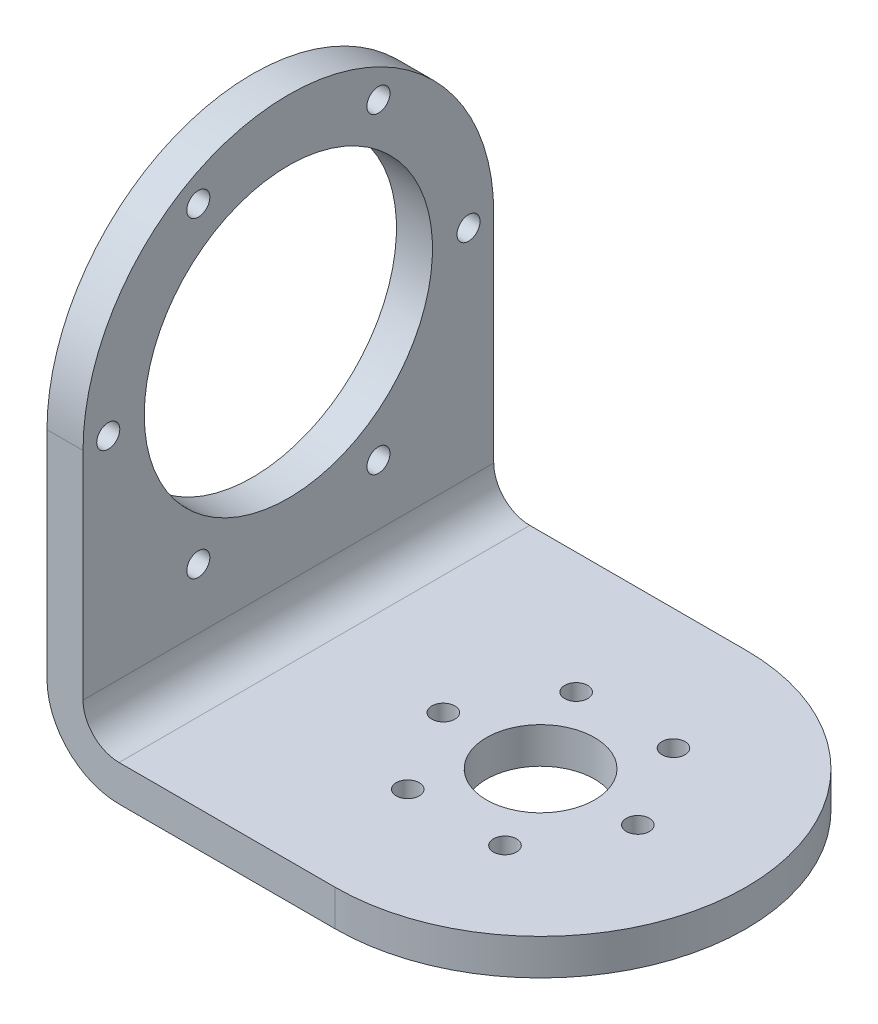
ISO-10303-21;
HEADER;
FILE_DESCRIPTION(('STEP AP214'),'2;1');
FILE_NAME('part.step','',(''),(''),'','','');
FILE_SCHEMA(('AUTOMOTIVE_DESIGN { 1 0 10303 214 1 1 1 1 }'));
ENDSEC;
DATA;
#1=APPLICATION_CONTEXT('core data for automotive mechanical design processes');
#2=APPLICATION_PROTOCOL_DEFINITION('international standard','automotive_design',2000,#1);
#3=PRODUCT_CONTEXT('',#1,'mechanical');
#4=PRODUCT('Part','Part','',(#3));
#5=PRODUCT_RELATED_PRODUCT_CATEGORY('part','',(#4));
#6=PRODUCT_DEFINITION_FORMATION('','',#4);
#7=PRODUCT_DEFINITION_CONTEXT('part definition',#1,'design');
#8=PRODUCT_DEFINITION('design','',#6,#7);
#9=PRODUCT_DEFINITION_SHAPE('','',#8);
#10=(LENGTH_UNIT() NAMED_UNIT(*) SI_UNIT(.MILLI.,.METRE.));
#11=(NAMED_UNIT(*) PLANE_ANGLE_UNIT() SI_UNIT($,.RADIAN.));
#12=(NAMED_UNIT(*) SI_UNIT($,.STERADIAN.) SOLID_ANGLE_UNIT());
#13=UNCERTAINTY_MEASURE_WITH_UNIT(LENGTH_MEASURE(1.E-05),#10,'distance_accuracy_value','');
#14=(GEOMETRIC_REPRESENTATION_CONTEXT(3) GLOBAL_UNCERTAINTY_ASSIGNED_CONTEXT((#13)) GLOBAL_UNIT_ASSIGNED_CONTEXT((#10,
#11,#12)) REPRESENTATION_CONTEXT('',''));
#15=CARTESIAN_POINT('',(0.,0.,0.));
#16=DIRECTION('',(0.,0.,1.));
#17=DIRECTION('',(1.,0.,0.));
#18=AXIS2_PLACEMENT_3D('',#15,#16,#17);
#19=CARTESIAN_POINT('',(0.,5.,28.5));
#20=DIRECTION('',(0.,0.,-1.));
#21=DIRECTION('',(-1.,0.,0.));
#22=AXIS2_PLACEMENT_3D('',#19,#20,#21);
#23=PLANE('',#22);
#24=DIRECTION('',(0.,-1.,0.));
#25=VECTOR('',#24,1.);
#26=CARTESIAN_POINT('',(-40.,5.,28.5));
#27=LINE('',#26,#25);
#28=CARTESIAN_POINT('',(-40.,40.,28.5));
#29=VERTEX_POINT('',#28);
#30=CARTESIAN_POINT('',(-40.,10.,28.5));
#31=VERTEX_POINT('',#30);
#32=EDGE_CURVE('E184',#29,#31,#27,.T.);
#33=ORIENTED_EDGE('',*,*,#32,.T.);
#34=CARTESIAN_POINT('',(-30.,10.,28.5));
#35=DIRECTION('',(0.,0.,-1.));
#36=DIRECTION('',(-1.,0.,0.));
#37=AXIS2_PLACEMENT_3D('',#34,#35,#36);
#38=CIRCLE('',#37,10.);
#39=CARTESIAN_POINT('',(-30.,0.,28.5));
#40=VERTEX_POINT('',#39);
#41=EDGE_CURVE('E203',#31,#40,#38,.F.);
#42=ORIENTED_EDGE('',*,*,#41,.T.);
#43=DIRECTION('',(1.,0.,0.));
#44=VECTOR('',#43,1.);
#45=CARTESIAN_POINT('',(0.,0.,28.5));
#46=LINE('',#45,#44);
#47=CARTESIAN_POINT('',(0.,0.,28.5));
#48=VERTEX_POINT('',#47);
#49=EDGE_CURVE('E175',#40,#48,#46,.T.);
#50=ORIENTED_EDGE('',*,*,#49,.T.);
#51=DIRECTION('',(0.,-1.,0.));
#52=VECTOR('',#51,1.);
#53=CARTESIAN_POINT('',(0.,5.,28.5));
#54=LINE('',#53,#52);
#55=CARTESIAN_POINT('',(0.,5.,28.5));
#56=VERTEX_POINT('',#55);
#57=EDGE_CURVE('E197',#56,#48,#54,.T.);
#58=ORIENTED_EDGE('',*,*,#57,.F.);
#59=DIRECTION('',(1.,0.,0.));
#60=VECTOR('',#59,1.);
#61=CARTESIAN_POINT('',(0.,5.,28.5));
#62=LINE('',#61,#60);
#63=CARTESIAN_POINT('',(-30.,5.,28.5));
#64=VERTEX_POINT('',#63);
#65=EDGE_CURVE('E177',#64,#56,#62,.T.);
#66=ORIENTED_EDGE('',*,*,#65,.F.);
#67=CARTESIAN_POINT('',(-30.,10.,28.5));
#68=DIRECTION('',(0.,0.,-1.));
#69=DIRECTION('',(-1.,0.,0.));
#70=AXIS2_PLACEMENT_3D('',#67,#68,#69);
#71=CIRCLE('',#70,5.);
#72=CARTESIAN_POINT('',(-35.,10.,28.5));
#73=VERTEX_POINT('',#72);
#74=EDGE_CURVE('E11',#64,#73,#71,.T.);
#75=ORIENTED_EDGE('',*,*,#74,.T.);
#76=DIRECTION('',(0.,1.,0.));
#77=VECTOR('',#76,1.);
#78=CARTESIAN_POINT('',(-35.,0.,28.5));
#79=LINE('',#78,#77);
#80=CARTESIAN_POINT('',(-35.,40.,28.5));
#81=VERTEX_POINT('',#80);
#82=EDGE_CURVE('E103',#73,#81,#79,.T.);
#83=ORIENTED_EDGE('',*,*,#82,.T.);
#84=DIRECTION('',(-1.,0.,0.));
#85=VECTOR('',#84,1.);
#86=CARTESIAN_POINT('',(-35.,40.,28.5));
#87=LINE('',#86,#85);
#88=EDGE_CURVE('E106',#81,#29,#87,.T.);
#89=ORIENTED_EDGE('',*,*,#88,.T.);
#90=EDGE_LOOP('',(#33,#42,#50,#58,#66,#75,#83,#89));
#91=FACE_BOUND('',#90,.T.);
#92=ADVANCED_FACE('F39',(#91),#23,.F.);
#93=CARTESIAN_POINT('',(0.,5.,0.));
#94=DIRECTION('',(0.,-1.,0.));
#95=DIRECTION('',(0.,0.,-1.));
#96=AXIS2_PLACEMENT_3D('',#93,#94,#95);
#97=CYLINDRICAL_SURFACE('',#96,28.5);
#98=CARTESIAN_POINT('',(0.,0.,0.));
#99=DIRECTION('',(0.,1.,0.));
#100=DIRECTION('',(0.,0.,1.));
#101=AXIS2_PLACEMENT_3D('',#98,#99,#100);
#102=CIRCLE('',#101,28.5);
#103=CARTESIAN_POINT('',(0.,0.,-28.5));
#104=VERTEX_POINT('',#103);
#105=EDGE_CURVE('E186',#48,#104,#102,.T.);
#106=ORIENTED_EDGE('',*,*,#105,.T.);
#107=DIRECTION('',(0.,-1.,0.));
#108=VECTOR('',#107,1.);
#109=CARTESIAN_POINT('',(0.,5.,-28.5));
#110=LINE('',#109,#108);
#111=CARTESIAN_POINT('',(0.,5.,-28.5));
#112=VERTEX_POINT('',#111);
#113=EDGE_CURVE('E194',#112,#104,#110,.T.);
#114=ORIENTED_EDGE('',*,*,#113,.F.);
#115=CARTESIAN_POINT('',(0.,5.,0.));
#116=DIRECTION('',(0.,1.,0.));
#117=DIRECTION('',(0.,0.,1.));
#118=AXIS2_PLACEMENT_3D('',#115,#116,#117);
#119=CIRCLE('',#118,28.5);
#120=EDGE_CURVE('E179',#56,#112,#119,.T.);
#121=ORIENTED_EDGE('',*,*,#120,.F.);
#122=ORIENTED_EDGE('',*,*,#57,.T.);
#123=EDGE_LOOP('',(#106,#114,#121,#122));
#124=FACE_BOUND('',#123,.T.);
#125=ADVANCED_FACE('F230',(#124),#97,.T.);
#126=CARTESIAN_POINT('',(0.,5.,-28.5));
#127=DIRECTION('',(0.,0.,1.));
#128=DIRECTION('',(1.,0.,0.));
#129=AXIS2_PLACEMENT_3D('',#126,#127,#128);
#130=PLANE('',#129);
#131=DIRECTION('',(-1.,0.,0.));
#132=VECTOR('',#131,1.);
#133=CARTESIAN_POINT('',(0.,0.,-28.5));
#134=LINE('',#133,#132);
#135=CARTESIAN_POINT('',(-30.,0.,-28.5));
#136=VERTEX_POINT('',#135);
#137=EDGE_CURVE('E180',#104,#136,#134,.T.);
#138=ORIENTED_EDGE('',*,*,#137,.T.);
#139=CARTESIAN_POINT('',(-30.,10.,-28.5));
#140=DIRECTION('',(0.,0.,1.));
#141=DIRECTION('',(1.,0.,0.));
#142=AXIS2_PLACEMENT_3D('',#139,#140,#141);
#143=CIRCLE('',#142,10.);
#144=CARTESIAN_POINT('',(-40.,10.,-28.5));
#145=VERTEX_POINT('',#144);
#146=EDGE_CURVE('E207',#136,#145,#143,.F.);
#147=ORIENTED_EDGE('',*,*,#146,.T.);
#148=DIRECTION('',(0.,-1.,0.));
#149=VECTOR('',#148,1.);
#150=CARTESIAN_POINT('',(-40.,5.,-28.5));
#151=LINE('',#150,#149);
#152=CARTESIAN_POINT('',(-40.,40.,-28.5));
#153=VERTEX_POINT('',#152);
#154=EDGE_CURVE('E191',#153,#145,#151,.T.);
#155=ORIENTED_EDGE('',*,*,#154,.F.);
#156=DIRECTION('',(-1.,0.,0.));
#157=VECTOR('',#156,1.);
#158=CARTESIAN_POINT('',(-35.,40.,-28.5));
#159=LINE('',#158,#157);
#160=CARTESIAN_POINT('',(-35.,40.,-28.5));
#161=VERTEX_POINT('',#160);
#162=EDGE_CURVE('E122',#161,#153,#159,.T.);
#163=ORIENTED_EDGE('',*,*,#162,.F.);
#164=DIRECTION('',(0.,-1.,0.));
#165=VECTOR('',#164,1.);
#166=CARTESIAN_POINT('',(-35.,0.,-28.5));
#167=LINE('',#166,#165);
#168=CARTESIAN_POINT('',(-35.,10.,-28.5));
#169=VERTEX_POINT('',#168);
#170=EDGE_CURVE('E128',#161,#169,#167,.T.);
#171=ORIENTED_EDGE('',*,*,#170,.T.);
#172=CARTESIAN_POINT('',(-30.,10.,-28.5));
#173=DIRECTION('',(0.,0.,1.));
#174=DIRECTION('',(1.,0.,0.));
#175=AXIS2_PLACEMENT_3D('',#172,#173,#174);
#176=CIRCLE('',#175,5.);
#177=CARTESIAN_POINT('',(-30.,5.,-28.5));
#178=VERTEX_POINT('',#177);
#179=EDGE_CURVE('E47',#169,#178,#176,.T.);
#180=ORIENTED_EDGE('',*,*,#179,.T.);
#181=DIRECTION('',(-1.,0.,0.));
#182=VECTOR('',#181,1.);
#183=CARTESIAN_POINT('',(0.,5.,-28.5));
#184=LINE('',#183,#182);
#185=EDGE_CURVE('E182',#112,#178,#184,.T.);
#186=ORIENTED_EDGE('',*,*,#185,.F.);
#187=ORIENTED_EDGE('',*,*,#113,.T.);
#188=EDGE_LOOP('',(#138,#147,#155,#163,#171,#180,#186,#187));
#189=FACE_BOUND('',#188,.T.);
#190=ADVANCED_FACE('F212',(#189),#130,.F.);
#191=CARTESIAN_POINT('',(-40.,5.,0.));
#192=DIRECTION('',(1.,0.,0.));
#193=DIRECTION('',(0.,0.,-1.));
#194=AXIS2_PLACEMENT_3D('',#191,#192,#193);
#195=PLANE('',#194);
#196=ORIENTED_EDGE('',*,*,#154,.T.);
#197=DIRECTION('',(0.,0.,1.));
#198=VECTOR('',#197,1.);
#199=CARTESIAN_POINT('',(-40.,10.,0.));
#200=LINE('',#199,#198);
#201=EDGE_CURVE('E200',#145,#31,#200,.T.);
#202=ORIENTED_EDGE('',*,*,#201,.T.);
#203=ORIENTED_EDGE('',*,*,#32,.F.);
#204=CARTESIAN_POINT('',(-40.,40.,0.));
#205=DIRECTION('',(-1.,0.,0.));
#206=DIRECTION('',(0.,0.,1.));
#207=AXIS2_PLACEMENT_3D('',#204,#205,#206);
#208=CIRCLE('',#207,28.5);
#209=EDGE_CURVE('E121',#29,#153,#208,.T.);
#210=ORIENTED_EDGE('',*,*,#209,.T.);
#211=EDGE_LOOP('',(#196,#202,#203,#210));
#212=FACE_BOUND('',#211,.T.);
#213=CARTESIAN_POINT('',(-40.,39.9999999999999,-24.9999999999994));
#214=DIRECTION('',(-1.,0.,0.));
#215=DIRECTION('',(0.,0.,1.));
#216=AXIS2_PLACEMENT_3D('',#213,#214,#215);
#217=CIRCLE('',#216,1.6);
#218=CARTESIAN_POINT('',(-40.,39.9999999999999,-23.3999999999994));
#219=VERTEX_POINT('',#218);
#220=EDGE_CURVE('E154',#219,#219,#217,.T.);
#221=ORIENTED_EDGE('',*,*,#220,.F.);
#222=EDGE_LOOP('',(#221));
#223=FACE_BOUND('',#222,.T.);
#224=CARTESIAN_POINT('',(-40.,18.3493649053891,-12.4999999999989));
#225=DIRECTION('',(-1.,0.,0.));
#226=DIRECTION('',(0.,0.,1.));
#227=AXIS2_PLACEMENT_3D('',#224,#225,#226);
#228=CIRCLE('',#227,1.60000000000001);
#229=CARTESIAN_POINT('',(-40.,18.3493649053891,-10.8999999999989));
#230=VERTEX_POINT('',#229);
#231=EDGE_CURVE('E158',#230,#230,#228,.T.);
#232=ORIENTED_EDGE('',*,*,#231,.F.);
#233=EDGE_LOOP('',(#232));
#234=FACE_BOUND('',#233,.T.);
#235=CARTESIAN_POINT('',(-40.,18.3493649053897,12.5000000000011));
#236=DIRECTION('',(-1.,0.,0.));
#237=DIRECTION('',(0.,0.,1.));
#238=AXIS2_PLACEMENT_3D('',#235,#236,#237);
#239=CIRCLE('',#238,1.6);
#240=CARTESIAN_POINT('',(-40.,18.3493649053897,14.1000000000011));
#241=VERTEX_POINT('',#240);
#242=EDGE_CURVE('E161',#241,#241,#239,.T.);
#243=ORIENTED_EDGE('',*,*,#242,.F.);
#244=EDGE_LOOP('',(#243));
#245=FACE_BOUND('',#244,.T.);
#246=CARTESIAN_POINT('',(-40.,40.000000000001,25.0000000000006));
#247=DIRECTION('',(-1.,0.,0.));
#248=DIRECTION('',(0.,0.,1.));
#249=AXIS2_PLACEMENT_3D('',#246,#247,#248);
#250=CIRCLE('',#249,1.6);
#251=CARTESIAN_POINT('',(-40.,40.000000000001,26.6000000000006));
#252=VERTEX_POINT('',#251);
#253=EDGE_CURVE('E164',#252,#252,#250,.T.);
#254=ORIENTED_EDGE('',*,*,#253,.F.);
#255=EDGE_LOOP('',(#254));
#256=FACE_BOUND('',#255,.T.);
#257=CARTESIAN_POINT('',(-40.,61.6506350946116,12.5));
#258=DIRECTION('',(-1.,0.,0.));
#259=DIRECTION('',(0.,0.,1.));
#260=AXIS2_PLACEMENT_3D('',#257,#258,#259);
#261=CIRCLE('',#260,1.6);
#262=CARTESIAN_POINT('',(-40.,61.6506350946116,14.1));
#263=VERTEX_POINT('',#262);
#264=EDGE_CURVE('E167',#263,#263,#261,.T.);
#265=ORIENTED_EDGE('',*,*,#264,.F.);
#266=EDGE_LOOP('',(#265));
#267=FACE_BOUND('',#266,.T.);
#268=CARTESIAN_POINT('',(-40.,61.6506350946109,-12.5));
#269=DIRECTION('',(-1.,0.,0.));
#270=DIRECTION('',(0.,0.,1.));
#271=AXIS2_PLACEMENT_3D('',#268,#269,#270);
#272=CIRCLE('',#271,1.6);
#273=CARTESIAN_POINT('',(-40.,61.6506350946109,-10.9));
#274=VERTEX_POINT('',#273);
#275=EDGE_CURVE('E170',#274,#274,#272,.T.);
#276=ORIENTED_EDGE('',*,*,#275,.F.);
#277=EDGE_LOOP('',(#276));
#278=FACE_BOUND('',#277,.T.);
#279=CARTESIAN_POINT('',(-40.,40.,0.));
#280=DIRECTION('',(-1.,0.,0.));
#281=DIRECTION('',(0.,0.,1.));
#282=AXIS2_PLACEMENT_3D('',#279,#280,#281);
#283=CIRCLE('',#282,20.);
#284=CARTESIAN_POINT('',(-40.,40.,20.));
#285=VERTEX_POINT('',#284);
#286=EDGE_CURVE('E114',#285,#285,#283,.T.);
#287=ORIENTED_EDGE('',*,*,#286,.F.);
#288=EDGE_LOOP('',(#287));
#289=FACE_BOUND('',#288,.T.);
#290=ADVANCED_FACE('F214',(#212,#223,#234,#245,#256,#267,#278,#289),#195,.F.);
#291=CARTESIAN_POINT('',(0.,5.,0.));
#292=DIRECTION('',(0.,1.,0.));
#293=DIRECTION('',(0.,0.,1.));
#294=AXIS2_PLACEMENT_3D('',#291,#292,#293);
#295=PLANE('',#294);
#296=CARTESIAN_POINT('',(13.5,5.,0.));
#297=DIRECTION('',(0.,1.,0.));
#298=DIRECTION('',(0.,0.,1.));
#299=AXIS2_PLACEMENT_3D('',#296,#297,#298);
#300=CIRCLE('',#299,1.6);
#301=CARTESIAN_POINT('',(13.5,5.,1.6));
#302=VERTEX_POINT('',#301);
#303=EDGE_CURVE('E319',#302,#302,#300,.T.);
#304=ORIENTED_EDGE('',*,*,#303,.F.);
#305=EDGE_LOOP('',(#304));
#306=FACE_BOUND('',#305,.T.);
#307=CARTESIAN_POINT('',(-13.5,5.,0.));
#308=DIRECTION('',(0.,1.,0.));
#309=DIRECTION('',(0.,0.,1.));
#310=AXIS2_PLACEMENT_3D('',#307,#308,#309);
#311=CIRCLE('',#310,1.6);
#312=CARTESIAN_POINT('',(-13.5,5.,1.59999999999991));
#313=VERTEX_POINT('',#312);
#314=EDGE_CURVE('E337',#313,#313,#311,.T.);
#315=ORIENTED_EDGE('',*,*,#314,.F.);
#316=EDGE_LOOP('',(#315));
#317=FACE_BOUND('',#316,.T.);
#318=CARTESIAN_POINT('',(-6.75000000000005,5.,11.6913429510899));
#319=DIRECTION('',(0.,1.,0.));
#320=DIRECTION('',(0.,0.,1.));
#321=AXIS2_PLACEMENT_3D('',#318,#319,#320);
#322=CIRCLE('',#321,1.6);
#323=CARTESIAN_POINT('',(-6.75000000000005,5.,13.2913429510899));
#324=VERTEX_POINT('',#323);
#325=EDGE_CURVE('E331',#324,#324,#322,.T.);
#326=ORIENTED_EDGE('',*,*,#325,.F.);
#327=EDGE_LOOP('',(#326));
#328=FACE_BOUND('',#327,.T.);
#329=CARTESIAN_POINT('',(6.74999999999997,5.,11.6913429510899));
#330=DIRECTION('',(0.,1.,0.));
#331=DIRECTION('',(0.,0.,1.));
#332=AXIS2_PLACEMENT_3D('',#329,#330,#331);
#333=CIRCLE('',#332,1.6);
#334=CARTESIAN_POINT('',(6.74999999999997,5.,13.2913429510899));
#335=VERTEX_POINT('',#334);
#336=EDGE_CURVE('E330',#335,#335,#333,.T.);
#337=ORIENTED_EDGE('',*,*,#336,.F.);
#338=EDGE_LOOP('',(#337));
#339=FACE_BOUND('',#338,.T.);
#340=CARTESIAN_POINT('',(0.,5.,0.));
#341=DIRECTION('',(0.,1.,0.));
#342=DIRECTION('',(0.,0.,1.));
#343=AXIS2_PLACEMENT_3D('',#340,#341,#342);
#344=CIRCLE('',#343,7.5);
#345=CARTESIAN_POINT('',(0.,5.,7.5));
#346=VERTEX_POINT('',#345);
#347=EDGE_CURVE('E324',#346,#346,#344,.T.);
#348=ORIENTED_EDGE('',*,*,#347,.F.);
#349=EDGE_LOOP('',(#348));
#350=FACE_BOUND('',#349,.T.);
#351=CARTESIAN_POINT('',(-6.74999999999989,5.,-11.69134295109));
#352=DIRECTION('',(0.,1.,0.));
#353=DIRECTION('',(0.,0.,1.));
#354=AXIS2_PLACEMENT_3D('',#351,#352,#353);
#355=CIRCLE('',#354,1.6);
#356=CARTESIAN_POINT('',(-6.74999999999989,5.,-10.09134295109));
#357=VERTEX_POINT('',#356);
#358=EDGE_CURVE('E350',#357,#357,#355,.T.);
#359=ORIENTED_EDGE('',*,*,#358,.F.);
#360=EDGE_LOOP('',(#359));
#361=FACE_BOUND('',#360,.T.);
#362=CARTESIAN_POINT('',(6.75000000000014,5.,-11.6913429510898));
#363=DIRECTION('',(0.,1.,0.));
#364=DIRECTION('',(0.,0.,1.));
#365=AXIS2_PLACEMENT_3D('',#362,#363,#364);
#366=CIRCLE('',#365,1.6);
#367=CARTESIAN_POINT('',(6.75000000000014,5.,-10.0913429510898));
#368=VERTEX_POINT('',#367);
#369=EDGE_CURVE('E355',#368,#368,#366,.T.);
#370=ORIENTED_EDGE('',*,*,#369,.F.);
#371=EDGE_LOOP('',(#370));
#372=FACE_BOUND('',#371,.T.);
#373=ORIENTED_EDGE('',*,*,#185,.T.);
#374=DIRECTION('',(0.,0.,-1.));
#375=VECTOR('',#374,1.);
#376=CARTESIAN_POINT('',(-30.,5.,0.));
#377=LINE('',#376,#375);
#378=EDGE_CURVE('E60',#178,#64,#377,.F.);
#379=ORIENTED_EDGE('',*,*,#378,.T.);
#380=ORIENTED_EDGE('',*,*,#65,.T.);
#381=ORIENTED_EDGE('',*,*,#120,.T.);
#382=EDGE_LOOP('',(#373,#379,#380,#381));
#383=FACE_BOUND('',#382,.T.);
#384=ADVANCED_FACE('F251',(#306,#317,#328,#339,#350,#361,#372,#383),#295,.T.);
#385=CARTESIAN_POINT('',(0.,0.,0.));
#386=DIRECTION('',(0.,1.,0.));
#387=DIRECTION('',(0.,0.,1.));
#388=AXIS2_PLACEMENT_3D('',#385,#386,#387);
#389=PLANE('',#388);
#390=CARTESIAN_POINT('',(13.5,0.,0.));
#391=DIRECTION('',(0.,1.,0.));
#392=DIRECTION('',(0.,0.,1.));
#393=AXIS2_PLACEMENT_3D('',#390,#391,#392);
#394=CIRCLE('',#393,1.6);
#395=CARTESIAN_POINT('',(13.5,0.,1.6));
#396=VERTEX_POINT('',#395);
#397=EDGE_CURVE('E155',#396,#396,#394,.T.);
#398=ORIENTED_EDGE('',*,*,#397,.T.);
#399=EDGE_LOOP('',(#398));
#400=FACE_BOUND('',#399,.T.);
#401=CARTESIAN_POINT('',(-13.5,0.,0.));
#402=DIRECTION('',(0.,1.,0.));
#403=DIRECTION('',(0.,0.,1.));
#404=AXIS2_PLACEMENT_3D('',#401,#402,#403);
#405=CIRCLE('',#404,1.6);
#406=CARTESIAN_POINT('',(-13.5,0.,1.59999999999991));
#407=VERTEX_POINT('',#406);
#408=EDGE_CURVE('E334',#407,#407,#405,.T.);
#409=ORIENTED_EDGE('',*,*,#408,.T.);
#410=EDGE_LOOP('',(#409));
#411=FACE_BOUND('',#410,.T.);
#412=CARTESIAN_POINT('',(-6.75000000000005,0.,11.6913429510899));
#413=DIRECTION('',(0.,1.,0.));
#414=DIRECTION('',(0.,0.,1.));
#415=AXIS2_PLACEMENT_3D('',#412,#413,#414);
#416=CIRCLE('',#415,1.6);
#417=CARTESIAN_POINT('',(-6.75000000000005,0.,13.2913429510899));
#418=VERTEX_POINT('',#417);
#419=EDGE_CURVE('E327',#418,#418,#416,.T.);
#420=ORIENTED_EDGE('',*,*,#419,.T.);
#421=EDGE_LOOP('',(#420));
#422=FACE_BOUND('',#421,.T.);
#423=CARTESIAN_POINT('',(6.74999999999997,0.,11.6913429510899));
#424=DIRECTION('',(0.,1.,0.));
#425=DIRECTION('',(0.,0.,1.));
#426=AXIS2_PLACEMENT_3D('',#423,#424,#425);
#427=CIRCLE('',#426,1.6);
#428=CARTESIAN_POINT('',(6.74999999999997,0.,13.2913429510899));
#429=VERTEX_POINT('',#428);
#430=EDGE_CURVE('E343',#429,#429,#427,.T.);
#431=ORIENTED_EDGE('',*,*,#430,.T.);
#432=EDGE_LOOP('',(#431));
#433=FACE_BOUND('',#432,.T.);
#434=CARTESIAN_POINT('',(0.,0.,0.));
#435=DIRECTION('',(0.,1.,0.));
#436=DIRECTION('',(0.,0.,1.));
#437=AXIS2_PLACEMENT_3D('',#434,#435,#436);
#438=CIRCLE('',#437,7.5);
#439=CARTESIAN_POINT('',(0.,0.,7.5));
#440=VERTEX_POINT('',#439);
#441=EDGE_CURVE('E320',#440,#440,#438,.T.);
#442=ORIENTED_EDGE('',*,*,#441,.T.);
#443=EDGE_LOOP('',(#442));
#444=FACE_BOUND('',#443,.T.);
#445=CARTESIAN_POINT('',(-6.74999999999989,0.,-11.69134295109));
#446=DIRECTION('',(0.,1.,0.));
#447=DIRECTION('',(0.,0.,1.));
#448=AXIS2_PLACEMENT_3D('',#445,#446,#447);
#449=CIRCLE('',#448,1.6);
#450=CARTESIAN_POINT('',(-6.74999999999989,0.,-10.09134295109));
#451=VERTEX_POINT('',#450);
#452=EDGE_CURVE('E339',#451,#451,#449,.T.);
#453=ORIENTED_EDGE('',*,*,#452,.T.);
#454=EDGE_LOOP('',(#453));
#455=FACE_BOUND('',#454,.T.);
#456=CARTESIAN_POINT('',(6.75000000000014,0.,-11.6913429510898));
#457=DIRECTION('',(0.,1.,0.));
#458=DIRECTION('',(0.,0.,1.));
#459=AXIS2_PLACEMENT_3D('',#456,#457,#458);
#460=CIRCLE('',#459,1.6);
#461=CARTESIAN_POINT('',(6.75000000000014,0.,-10.0913429510898));
#462=VERTEX_POINT('',#461);
#463=EDGE_CURVE('E353',#462,#462,#460,.T.);
#464=ORIENTED_EDGE('',*,*,#463,.T.);
#465=EDGE_LOOP('',(#464));
#466=FACE_BOUND('',#465,.T.);
#467=ORIENTED_EDGE('',*,*,#49,.F.);
#468=DIRECTION('',(0.,0.,1.));
#469=VECTOR('',#468,1.);
#470=CARTESIAN_POINT('',(-30.,0.,0.));
#471=LINE('',#470,#469);
#472=EDGE_CURVE('E205',#40,#136,#471,.F.);
#473=ORIENTED_EDGE('',*,*,#472,.T.);
#474=ORIENTED_EDGE('',*,*,#137,.F.);
#475=ORIENTED_EDGE('',*,*,#105,.F.);
#476=EDGE_LOOP('',(#467,#473,#474,#475));
#477=FACE_BOUND('',#476,.T.);
#478=ADVANCED_FACE('F223',(#400,#411,#422,#433,#444,#455,#466,#477),#389,.F.);
#479=CARTESIAN_POINT('',(-35.,61.6506350946109,-12.5));
#480=DIRECTION('',(-1.,0.,0.));
#481=DIRECTION('',(0.,0.,1.));
#482=AXIS2_PLACEMENT_3D('',#479,#480,#481);
#483=CYLINDRICAL_SURFACE('',#482,1.6);
#484=CARTESIAN_POINT('',(-35.,61.6506350946109,-12.5));
#485=DIRECTION('',(-1.,0.,0.));
#486=DIRECTION('',(0.,0.,1.));
#487=AXIS2_PLACEMENT_3D('',#484,#485,#486);
#488=CIRCLE('',#487,1.6);
#489=CARTESIAN_POINT('',(-35.,61.6506350946109,-10.9));
#490=VERTEX_POINT('',#489);
#491=EDGE_CURVE('E148',#490,#490,#488,.T.);
#492=ORIENTED_EDGE('',*,*,#491,.F.);
#493=EDGE_LOOP('',(#492));
#494=FACE_BOUND('',#493,.T.);
#495=ORIENTED_EDGE('',*,*,#275,.T.);
#496=EDGE_LOOP('',(#495));
#497=FACE_BOUND('',#496,.T.);
#498=ADVANCED_FACE('F254',(#494,#497),#483,.F.);
#499=CARTESIAN_POINT('',(-35.,61.6506350946116,12.5));
#500=DIRECTION('',(-1.,0.,0.));
#501=DIRECTION('',(0.,0.,1.));
#502=AXIS2_PLACEMENT_3D('',#499,#500,#501);
#503=CYLINDRICAL_SURFACE('',#502,1.6);
#504=CARTESIAN_POINT('',(-35.,61.6506350946116,12.5));
#505=DIRECTION('',(-1.,0.,0.));
#506=DIRECTION('',(0.,0.,1.));
#507=AXIS2_PLACEMENT_3D('',#504,#505,#506);
#508=CIRCLE('',#507,1.6);
#509=CARTESIAN_POINT('',(-35.,61.6506350946116,14.1));
#510=VERTEX_POINT('',#509);
#511=EDGE_CURVE('E145',#510,#510,#508,.T.);
#512=ORIENTED_EDGE('',*,*,#511,.F.);
#513=EDGE_LOOP('',(#512));
#514=FACE_BOUND('',#513,.T.);
#515=ORIENTED_EDGE('',*,*,#264,.T.);
#516=EDGE_LOOP('',(#515));
#517=FACE_BOUND('',#516,.T.);
#518=ADVANCED_FACE('F277',(#514,#517),#503,.F.);
#519=CARTESIAN_POINT('',(-35.,40.000000000001,25.0000000000006));
#520=DIRECTION('',(-1.,0.,0.));
#521=DIRECTION('',(0.,0.,1.));
#522=AXIS2_PLACEMENT_3D('',#519,#520,#521);
#523=CYLINDRICAL_SURFACE('',#522,1.6);
#524=CARTESIAN_POINT('',(-35.,40.000000000001,25.0000000000006));
#525=DIRECTION('',(-1.,0.,0.));
#526=DIRECTION('',(0.,0.,1.));
#527=AXIS2_PLACEMENT_3D('',#524,#525,#526);
#528=CIRCLE('',#527,1.6);
#529=CARTESIAN_POINT('',(-35.,40.000000000001,26.6000000000006));
#530=VERTEX_POINT('',#529);
#531=EDGE_CURVE('E142',#530,#530,#528,.T.);
#532=ORIENTED_EDGE('',*,*,#531,.F.);
#533=EDGE_LOOP('',(#532));
#534=FACE_BOUND('',#533,.T.);
#535=ORIENTED_EDGE('',*,*,#253,.T.);
#536=EDGE_LOOP('',(#535));
#537=FACE_BOUND('',#536,.T.);
#538=ADVANCED_FACE('F273',(#534,#537),#523,.F.);
#539=CARTESIAN_POINT('',(-35.,18.3493649053897,12.5000000000011));
#540=DIRECTION('',(-1.,0.,0.));
#541=DIRECTION('',(0.,0.,1.));
#542=AXIS2_PLACEMENT_3D('',#539,#540,#541);
#543=CYLINDRICAL_SURFACE('',#542,1.6);
#544=CARTESIAN_POINT('',(-35.,18.3493649053897,12.5000000000011));
#545=DIRECTION('',(-1.,0.,0.));
#546=DIRECTION('',(0.,0.,1.));
#547=AXIS2_PLACEMENT_3D('',#544,#545,#546);
#548=CIRCLE('',#547,1.6);
#549=CARTESIAN_POINT('',(-35.,18.3493649053897,14.1000000000011));
#550=VERTEX_POINT('',#549);
#551=EDGE_CURVE('E139',#550,#550,#548,.T.);
#552=ORIENTED_EDGE('',*,*,#551,.F.);
#553=EDGE_LOOP('',(#552));
#554=FACE_BOUND('',#553,.T.);
#555=ORIENTED_EDGE('',*,*,#242,.T.);
#556=EDGE_LOOP('',(#555));
#557=FACE_BOUND('',#556,.T.);
#558=ADVANCED_FACE('F269',(#554,#557),#543,.F.);
#559=CARTESIAN_POINT('',(-35.,18.3493649053891,-12.4999999999989));
#560=DIRECTION('',(-1.,0.,0.));
#561=DIRECTION('',(0.,0.,1.));
#562=AXIS2_PLACEMENT_3D('',#559,#560,#561);
#563=CYLINDRICAL_SURFACE('',#562,1.60000000000001);
#564=CARTESIAN_POINT('',(-35.,18.3493649053891,-12.4999999999989));
#565=DIRECTION('',(-1.,0.,0.));
#566=DIRECTION('',(0.,0.,1.));
#567=AXIS2_PLACEMENT_3D('',#564,#565,#566);
#568=CIRCLE('',#567,1.60000000000001);
#569=CARTESIAN_POINT('',(-35.,18.3493649053891,-10.8999999999989));
#570=VERTEX_POINT('',#569);
#571=EDGE_CURVE('E136',#570,#570,#568,.T.);
#572=ORIENTED_EDGE('',*,*,#571,.F.);
#573=EDGE_LOOP('',(#572));
#574=FACE_BOUND('',#573,.T.);
#575=ORIENTED_EDGE('',*,*,#231,.T.);
#576=EDGE_LOOP('',(#575));
#577=FACE_BOUND('',#576,.T.);
#578=ADVANCED_FACE('F265',(#574,#577),#563,.F.);
#579=CARTESIAN_POINT('',(-35.,39.9999999999999,-24.9999999999994));
#580=DIRECTION('',(-1.,0.,0.));
#581=DIRECTION('',(0.,0.,1.));
#582=AXIS2_PLACEMENT_3D('',#579,#580,#581);
#583=CYLINDRICAL_SURFACE('',#582,1.6);
#584=CARTESIAN_POINT('',(-35.,39.9999999999999,-24.9999999999994));
#585=DIRECTION('',(-1.,0.,0.));
#586=DIRECTION('',(0.,0.,1.));
#587=AXIS2_PLACEMENT_3D('',#584,#585,#586);
#588=CIRCLE('',#587,1.6);
#589=CARTESIAN_POINT('',(-35.,39.9999999999999,-23.3999999999994));
#590=VERTEX_POINT('',#589);
#591=EDGE_CURVE('E130',#590,#590,#588,.T.);
#592=ORIENTED_EDGE('',*,*,#591,.F.);
#593=EDGE_LOOP('',(#592));
#594=FACE_BOUND('',#593,.T.);
#595=ORIENTED_EDGE('',*,*,#220,.T.);
#596=EDGE_LOOP('',(#595));
#597=FACE_BOUND('',#596,.T.);
#598=ADVANCED_FACE('F262',(#594,#597),#583,.F.);
#599=CARTESIAN_POINT('',(-35.,40.,0.));
#600=DIRECTION('',(-1.,0.,0.));
#601=DIRECTION('',(0.,0.,1.));
#602=AXIS2_PLACEMENT_3D('',#599,#600,#601);
#603=CYLINDRICAL_SURFACE('',#602,28.5);
#604=ORIENTED_EDGE('',*,*,#209,.F.);
#605=ORIENTED_EDGE('',*,*,#88,.F.);
#606=CARTESIAN_POINT('',(-35.,40.,0.));
#607=DIRECTION('',(-1.,0.,0.));
#608=DIRECTION('',(0.,0.,1.));
#609=AXIS2_PLACEMENT_3D('',#606,#607,#608);
#610=CIRCLE('',#609,28.5);
#611=EDGE_CURVE('E113',#81,#161,#610,.T.);
#612=ORIENTED_EDGE('',*,*,#611,.T.);
#613=ORIENTED_EDGE('',*,*,#162,.T.);
#614=EDGE_LOOP('',(#604,#605,#612,#613));
#615=FACE_BOUND('',#614,.T.);
#616=ADVANCED_FACE('F118',(#615),#603,.T.);
#617=CARTESIAN_POINT('',(-35.,40.,0.));
#618=DIRECTION('',(-1.,0.,0.));
#619=DIRECTION('',(0.,0.,1.));
#620=AXIS2_PLACEMENT_3D('',#617,#618,#619);
#621=CYLINDRICAL_SURFACE('',#620,20.);
#622=CARTESIAN_POINT('',(-35.,40.,0.));
#623=DIRECTION('',(-1.,0.,0.));
#624=DIRECTION('',(0.,0.,1.));
#625=AXIS2_PLACEMENT_3D('',#622,#623,#624);
#626=CIRCLE('',#625,20.);
#627=CARTESIAN_POINT('',(-35.,40.,20.));
#628=VERTEX_POINT('',#627);
#629=EDGE_CURVE('E123',#628,#628,#626,.T.);
#630=ORIENTED_EDGE('',*,*,#629,.F.);
#631=EDGE_LOOP('',(#630));
#632=FACE_BOUND('',#631,.T.);
#633=ORIENTED_EDGE('',*,*,#286,.T.);
#634=EDGE_LOOP('',(#633));
#635=FACE_BOUND('',#634,.T.);
#636=ADVANCED_FACE('F261',(#632,#635),#621,.F.);
#637=CARTESIAN_POINT('',(-35.,0.,0.));
#638=DIRECTION('',(-1.,0.,0.));
#639=DIRECTION('',(0.,0.,1.));
#640=AXIS2_PLACEMENT_3D('',#637,#638,#639);
#641=PLANE('',#640);
#642=ORIENTED_EDGE('',*,*,#82,.F.);
#643=DIRECTION('',(0.,0.,-1.));
#644=VECTOR('',#643,1.);
#645=CARTESIAN_POINT('',(-35.,10.,0.));
#646=LINE('',#645,#644);
#647=EDGE_CURVE('E209',#73,#169,#646,.T.);
#648=ORIENTED_EDGE('',*,*,#647,.T.);
#649=ORIENTED_EDGE('',*,*,#170,.F.);
#650=ORIENTED_EDGE('',*,*,#611,.F.);
#651=EDGE_LOOP('',(#642,#648,#649,#650));
#652=FACE_BOUND('',#651,.T.);
#653=ORIENTED_EDGE('',*,*,#591,.T.);
#654=EDGE_LOOP('',(#653));
#655=FACE_BOUND('',#654,.T.);
#656=ORIENTED_EDGE('',*,*,#571,.T.);
#657=EDGE_LOOP('',(#656));
#658=FACE_BOUND('',#657,.T.);
#659=ORIENTED_EDGE('',*,*,#551,.T.);
#660=EDGE_LOOP('',(#659));
#661=FACE_BOUND('',#660,.T.);
#662=ORIENTED_EDGE('',*,*,#531,.T.);
#663=EDGE_LOOP('',(#662));
#664=FACE_BOUND('',#663,.T.);
#665=ORIENTED_EDGE('',*,*,#511,.T.);
#666=EDGE_LOOP('',(#665));
#667=FACE_BOUND('',#666,.T.);
#668=ORIENTED_EDGE('',*,*,#491,.T.);
#669=EDGE_LOOP('',(#668));
#670=FACE_BOUND('',#669,.T.);
#671=ORIENTED_EDGE('',*,*,#629,.T.);
#672=EDGE_LOOP('',(#671));
#673=FACE_BOUND('',#672,.T.);
#674=ADVANCED_FACE('F126',(#652,#655,#658,#661,#664,#667,#670,#673),#641,.F.);
#675=CARTESIAN_POINT('',(-30.,10.,0.));
#676=DIRECTION('',(0.,0.,1.));
#677=DIRECTION('',(1.,0.,0.));
#678=AXIS2_PLACEMENT_3D('',#675,#676,#677);
#679=CYLINDRICAL_SURFACE('',#678,10.);
#680=ORIENTED_EDGE('',*,*,#146,.F.);
#681=ORIENTED_EDGE('',*,*,#472,.F.);
#682=ORIENTED_EDGE('',*,*,#41,.F.);
#683=ORIENTED_EDGE('',*,*,#201,.F.);
#684=EDGE_LOOP('',(#680,#681,#682,#683));
#685=FACE_BOUND('',#684,.T.);
#686=ADVANCED_FACE('F226',(#685),#679,.T.);
#687=CARTESIAN_POINT('',(-30.,10.,0.));
#688=DIRECTION('',(0.,0.,-1.));
#689=DIRECTION('',(-1.,0.,0.));
#690=AXIS2_PLACEMENT_3D('',#687,#688,#689);
#691=CYLINDRICAL_SURFACE('',#690,5.);
#692=ORIENTED_EDGE('',*,*,#74,.F.);
#693=ORIENTED_EDGE('',*,*,#378,.F.);
#694=ORIENTED_EDGE('',*,*,#179,.F.);
#695=ORIENTED_EDGE('',*,*,#647,.F.);
#696=EDGE_LOOP('',(#692,#693,#694,#695));
#697=FACE_BOUND('',#696,.T.);
#698=ADVANCED_FACE('F41',(#697),#691,.F.);
#699=CARTESIAN_POINT('',(6.75000000000014,0.,-11.6913429510898));
#700=DIRECTION('',(0.,1.,0.));
#701=DIRECTION('',(0.,0.,1.));
#702=AXIS2_PLACEMENT_3D('',#699,#700,#701);
#703=CYLINDRICAL_SURFACE('',#702,1.6);
#704=ORIENTED_EDGE('',*,*,#463,.F.);
#705=EDGE_LOOP('',(#704));
#706=FACE_BOUND('',#705,.T.);
#707=ORIENTED_EDGE('',*,*,#369,.T.);
#708=EDGE_LOOP('',(#707));
#709=FACE_BOUND('',#708,.T.);
#710=ADVANCED_FACE('F232',(#706,#709),#703,.F.);
#711=CARTESIAN_POINT('',(-6.74999999999989,0.,-11.69134295109));
#712=DIRECTION('',(0.,1.,0.));
#713=DIRECTION('',(0.,0.,1.));
#714=AXIS2_PLACEMENT_3D('',#711,#712,#713);
#715=CYLINDRICAL_SURFACE('',#714,1.6);
#716=ORIENTED_EDGE('',*,*,#452,.F.);
#717=EDGE_LOOP('',(#716));
#718=FACE_BOUND('',#717,.T.);
#719=ORIENTED_EDGE('',*,*,#358,.T.);
#720=EDGE_LOOP('',(#719));
#721=FACE_BOUND('',#720,.T.);
#722=ADVANCED_FACE('F237',(#718,#721),#715,.F.);
#723=CARTESIAN_POINT('',(0.,0.,0.));
#724=DIRECTION('',(0.,1.,0.));
#725=DIRECTION('',(0.,0.,1.));
#726=AXIS2_PLACEMENT_3D('',#723,#724,#725);
#727=CYLINDRICAL_SURFACE('',#726,7.5);
#728=ORIENTED_EDGE('',*,*,#441,.F.);
#729=EDGE_LOOP('',(#728));
#730=FACE_BOUND('',#729,.T.);
#731=ORIENTED_EDGE('',*,*,#347,.T.);
#732=EDGE_LOOP('',(#731));
#733=FACE_BOUND('',#732,.T.);
#734=ADVANCED_FACE('F292',(#730,#733),#727,.F.);
#735=CARTESIAN_POINT('',(6.74999999999997,0.,11.6913429510899));
#736=DIRECTION('',(0.,1.,0.));
#737=DIRECTION('',(0.,0.,1.));
#738=AXIS2_PLACEMENT_3D('',#735,#736,#737);
#739=CYLINDRICAL_SURFACE('',#738,1.6);
#740=ORIENTED_EDGE('',*,*,#430,.F.);
#741=EDGE_LOOP('',(#740));
#742=FACE_BOUND('',#741,.T.);
#743=ORIENTED_EDGE('',*,*,#336,.T.);
#744=EDGE_LOOP('',(#743));
#745=FACE_BOUND('',#744,.T.);
#746=ADVANCED_FACE('F294',(#742,#745),#739,.F.);
#747=CARTESIAN_POINT('',(-6.75000000000005,0.,11.6913429510899));
#748=DIRECTION('',(0.,1.,0.));
#749=DIRECTION('',(0.,0.,1.));
#750=AXIS2_PLACEMENT_3D('',#747,#748,#749);
#751=CYLINDRICAL_SURFACE('',#750,1.6);
#752=ORIENTED_EDGE('',*,*,#419,.F.);
#753=EDGE_LOOP('',(#752));
#754=FACE_BOUND('',#753,.T.);
#755=ORIENTED_EDGE('',*,*,#325,.T.);
#756=EDGE_LOOP('',(#755));
#757=FACE_BOUND('',#756,.T.);
#758=ADVANCED_FACE('F297',(#754,#757),#751,.F.);
#759=CARTESIAN_POINT('',(-13.5,0.,0.));
#760=DIRECTION('',(0.,1.,0.));
#761=DIRECTION('',(0.,0.,1.));
#762=AXIS2_PLACEMENT_3D('',#759,#760,#761);
#763=CYLINDRICAL_SURFACE('',#762,1.6);
#764=ORIENTED_EDGE('',*,*,#408,.F.);
#765=EDGE_LOOP('',(#764));
#766=FACE_BOUND('',#765,.T.);
#767=ORIENTED_EDGE('',*,*,#314,.T.);
#768=EDGE_LOOP('',(#767));
#769=FACE_BOUND('',#768,.T.);
#770=ADVANCED_FACE('F302',(#766,#769),#763,.F.);
#771=CARTESIAN_POINT('',(13.5,0.,0.));
#772=DIRECTION('',(0.,1.,0.));
#773=DIRECTION('',(0.,0.,1.));
#774=AXIS2_PLACEMENT_3D('',#771,#772,#773);
#775=CYLINDRICAL_SURFACE('',#774,1.6);
#776=ORIENTED_EDGE('',*,*,#397,.F.);
#777=EDGE_LOOP('',(#776));
#778=FACE_BOUND('',#777,.T.);
#779=ORIENTED_EDGE('',*,*,#303,.T.);
#780=EDGE_LOOP('',(#779));
#781=FACE_BOUND('',#780,.T.);
#782=ADVANCED_FACE('F305',(#778,#781),#775,.F.);
#783=CLOSED_SHELL('',(#92,#125,#190,#290,#384,#478,#498,#518,#538,#558,#578,#598,#616,#636,#674,
#686,#698,#710,#722,#734,#746,#758,#770,#782));
#784=MANIFOLD_SOLID_BREP('B2',#783);
#785=ADVANCED_BREP_SHAPE_REPRESENTATION('',(#18,#784),#14);
#786=SHAPE_DEFINITION_REPRESENTATION(#9,#785);
ENDSEC;
END-ISO-10303-21;
